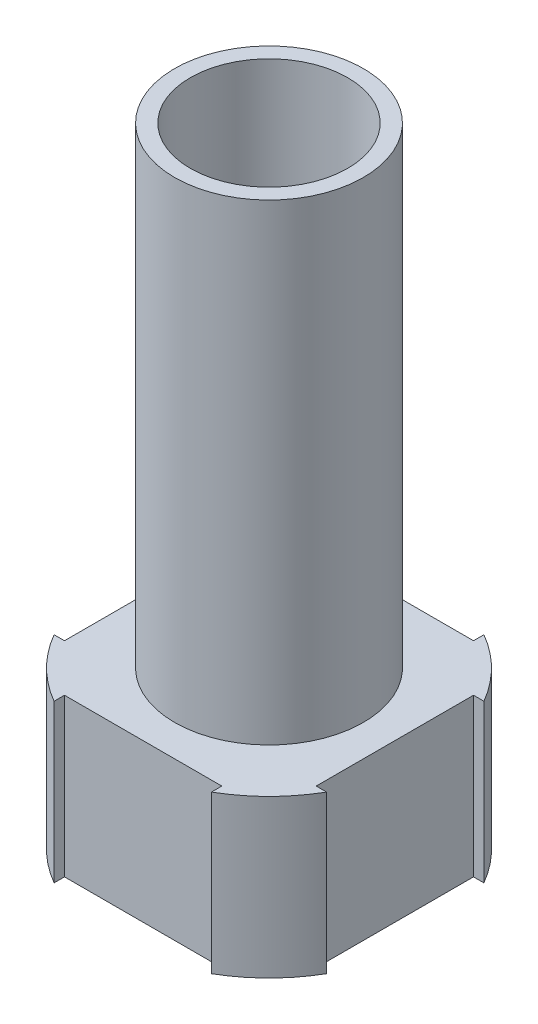
ISO-10303-21;
HEADER;
FILE_DESCRIPTION(('STEP AP214'),'2;1');
FILE_NAME('part.step','',(''),(''),'','','');
FILE_SCHEMA(('AUTOMOTIVE_DESIGN { 1 0 10303 214 1 1 1 1 }'));
ENDSEC;
DATA;
#1=APPLICATION_CONTEXT('core data for automotive mechanical design processes');
#2=APPLICATION_PROTOCOL_DEFINITION('international standard','automotive_design',2000,#1);
#3=PRODUCT_CONTEXT('',#1,'mechanical');
#4=PRODUCT('Part','Part','',(#3));
#5=PRODUCT_RELATED_PRODUCT_CATEGORY('part','',(#4));
#6=PRODUCT_DEFINITION_FORMATION('','',#4);
#7=PRODUCT_DEFINITION_CONTEXT('part definition',#1,'design');
#8=PRODUCT_DEFINITION('design','',#6,#7);
#9=PRODUCT_DEFINITION_SHAPE('','',#8);
#10=(LENGTH_UNIT() NAMED_UNIT(*) SI_UNIT(.MILLI.,.METRE.));
#11=(NAMED_UNIT(*) PLANE_ANGLE_UNIT() SI_UNIT($,.RADIAN.));
#12=(NAMED_UNIT(*) SI_UNIT($,.STERADIAN.) SOLID_ANGLE_UNIT());
#13=UNCERTAINTY_MEASURE_WITH_UNIT(LENGTH_MEASURE(1.E-05),#10,'distance_accuracy_value','');
#14=(GEOMETRIC_REPRESENTATION_CONTEXT(3) GLOBAL_UNCERTAINTY_ASSIGNED_CONTEXT((#13)) GLOBAL_UNIT_ASSIGNED_CONTEXT((#10,
#11,#12)) REPRESENTATION_CONTEXT('',''));
#15=CARTESIAN_POINT('',(0.,0.,0.));
#16=DIRECTION('',(0.,0.,1.));
#17=DIRECTION('',(1.,0.,0.));
#18=AXIS2_PLACEMENT_3D('',#15,#16,#17);
#19=CARTESIAN_POINT('',(0.,5.,0.));
#20=DIRECTION('',(0.,-1.,0.));
#21=DIRECTION('',(0.,0.,-1.));
#22=AXIS2_PLACEMENT_3D('',#19,#20,#21);
#23=CYLINDRICAL_SURFACE('',#22,5.);
#24=CARTESIAN_POINT('',(0.,0.,0.));
#25=DIRECTION('',(0.,1.,0.));
#26=DIRECTION('',(0.,0.,1.));
#27=AXIS2_PLACEMENT_3D('',#24,#25,#26);
#28=CIRCLE('',#27,5.);
#29=CARTESIAN_POINT('',(2.5,0.,4.33012701892219));
#30=VERTEX_POINT('',#29);
#31=CARTESIAN_POINT('',(4.33012701892219,0.,2.5));
#32=VERTEX_POINT('',#31);
#33=EDGE_CURVE('E272',#30,#32,#28,.T.);
#34=ORIENTED_EDGE('',*,*,#33,.T.);
#35=DIRECTION('',(0.,-1.,0.));
#36=VECTOR('',#35,1.);
#37=CARTESIAN_POINT('',(4.33012701892219,5.,2.5));
#38=LINE('',#37,#36);
#39=CARTESIAN_POINT('',(4.33012701892219,5.,2.5));
#40=VERTEX_POINT('',#39);
#41=EDGE_CURVE('E156',#32,#40,#38,.F.);
#42=ORIENTED_EDGE('',*,*,#41,.T.);
#43=CARTESIAN_POINT('',(0.,5.,0.));
#44=DIRECTION('',(0.,1.,0.));
#45=DIRECTION('',(0.,0.,1.));
#46=AXIS2_PLACEMENT_3D('',#43,#44,#45);
#47=CIRCLE('',#46,5.);
#48=CARTESIAN_POINT('',(2.5,5.,4.33012701892219));
#49=VERTEX_POINT('',#48);
#50=EDGE_CURVE('E273',#49,#40,#47,.T.);
#51=ORIENTED_EDGE('',*,*,#50,.F.);
#52=DIRECTION('',(0.,-1.,0.));
#53=VECTOR('',#52,1.);
#54=CARTESIAN_POINT('',(2.5,5.,4.33012701892219));
#55=LINE('',#54,#53);
#56=EDGE_CURVE('E254',#49,#30,#55,.T.);
#57=ORIENTED_EDGE('',*,*,#56,.T.);
#58=EDGE_LOOP('',(#34,#42,#51,#57));
#59=FACE_BOUND('',#58,.T.);
#60=ADVANCED_FACE('F36',(#59),#23,.T.);
#61=CARTESIAN_POINT('',(4.33012701892219,5.,-2.5));
#62=VERTEX_POINT('',#61);
#63=CARTESIAN_POINT('',(2.5,5.,-4.33012701892219));
#64=VERTEX_POINT('',#63);
#65=EDGE_CURVE('E276',#62,#64,#47,.T.);
#66=ORIENTED_EDGE('',*,*,#65,.F.);
#67=DIRECTION('',(0.,-1.,0.));
#68=VECTOR('',#67,1.);
#69=CARTESIAN_POINT('',(4.33012701892219,5.,-2.5));
#70=LINE('',#69,#68);
#71=CARTESIAN_POINT('',(4.33012701892219,0.,-2.5));
#72=VERTEX_POINT('',#71);
#73=EDGE_CURVE('E178',#62,#72,#70,.T.);
#74=ORIENTED_EDGE('',*,*,#73,.T.);
#75=CARTESIAN_POINT('',(2.5,0.,-4.33012701892219));
#76=VERTEX_POINT('',#75);
#77=EDGE_CURVE('E278',#72,#76,#28,.T.);
#78=ORIENTED_EDGE('',*,*,#77,.T.);
#79=DIRECTION('',(0.,-1.,0.));
#80=VECTOR('',#79,1.);
#81=CARTESIAN_POINT('',(2.5,5.,-4.33012701892219));
#82=LINE('',#81,#80);
#83=EDGE_CURVE('E208',#76,#64,#82,.F.);
#84=ORIENTED_EDGE('',*,*,#83,.T.);
#85=EDGE_LOOP('',(#66,#74,#78,#84));
#86=FACE_BOUND('',#85,.T.);
#87=ADVANCED_FACE('F295',(#86),#23,.T.);
#88=CARTESIAN_POINT('',(-2.5,5.,-4.33012701892219));
#89=VERTEX_POINT('',#88);
#90=CARTESIAN_POINT('',(-4.33012701892219,5.,-2.5));
#91=VERTEX_POINT('',#90);
#92=EDGE_CURVE('E321',#89,#91,#47,.T.);
#93=ORIENTED_EDGE('',*,*,#92,.F.);
#94=DIRECTION('',(0.,-1.,0.));
#95=VECTOR('',#94,1.);
#96=CARTESIAN_POINT('',(-2.5,5.,-4.33012701892219));
#97=LINE('',#96,#95);
#98=CARTESIAN_POINT('',(-2.5,0.,-4.33012701892219));
#99=VERTEX_POINT('',#98);
#100=EDGE_CURVE('E198',#89,#99,#97,.T.);
#101=ORIENTED_EDGE('',*,*,#100,.T.);
#102=CARTESIAN_POINT('',(-4.33012701892219,0.,-2.5));
#103=VERTEX_POINT('',#102);
#104=EDGE_CURVE('E331',#99,#103,#28,.T.);
#105=ORIENTED_EDGE('',*,*,#104,.T.);
#106=DIRECTION('',(0.,-1.,0.));
#107=VECTOR('',#106,1.);
#108=CARTESIAN_POINT('',(-4.33012701892219,5.,-2.5));
#109=LINE('',#108,#107);
#110=EDGE_CURVE('E236',#103,#91,#109,.F.);
#111=ORIENTED_EDGE('',*,*,#110,.T.);
#112=EDGE_LOOP('',(#93,#101,#105,#111));
#113=FACE_BOUND('',#112,.T.);
#114=ADVANCED_FACE('F288',(#113),#23,.T.);
#115=CARTESIAN_POINT('',(0.,20.,0.));
#116=DIRECTION('',(0.,-1.,0.));
#117=DIRECTION('',(0.,0.,-1.));
#118=AXIS2_PLACEMENT_3D('',#115,#116,#117);
#119=CYLINDRICAL_SURFACE('',#118,2.5);
#120=CARTESIAN_POINT('',(0.,20.,0.));
#121=DIRECTION('',(0.,1.,0.));
#122=DIRECTION('',(0.,0.,1.));
#123=AXIS2_PLACEMENT_3D('',#120,#121,#122);
#124=CIRCLE('',#123,2.5);
#125=CARTESIAN_POINT('',(0.,20.,2.5));
#126=VERTEX_POINT('',#125);
#127=EDGE_CURVE('E45',#126,#126,#124,.T.);
#128=ORIENTED_EDGE('',*,*,#127,.T.);
#129=EDGE_LOOP('',(#128));
#130=FACE_BOUND('',#129,.T.);
#131=CARTESIAN_POINT('',(0.,0.,0.));
#132=DIRECTION('',(0.,1.,0.));
#133=DIRECTION('',(0.,0.,1.));
#134=AXIS2_PLACEMENT_3D('',#131,#132,#133);
#135=CIRCLE('',#134,2.5);
#136=CARTESIAN_POINT('',(0.,0.,2.5));
#137=VERTEX_POINT('',#136);
#138=EDGE_CURVE('E40',#137,#137,#135,.T.);
#139=ORIENTED_EDGE('',*,*,#138,.F.);
#140=EDGE_LOOP('',(#139));
#141=FACE_BOUND('',#140,.T.);
#142=ADVANCED_FACE('F38',(#130,#141),#119,.F.);
#143=CARTESIAN_POINT('',(0.,20.,0.));
#144=DIRECTION('',(0.,-1.,0.));
#145=DIRECTION('',(0.,0.,-1.));
#146=AXIS2_PLACEMENT_3D('',#143,#144,#145);
#147=CYLINDRICAL_SURFACE('',#146,3.);
#148=CARTESIAN_POINT('',(0.,5.,0.));
#149=DIRECTION('',(0.,1.,0.));
#150=DIRECTION('',(0.,0.,1.));
#151=AXIS2_PLACEMENT_3D('',#148,#149,#150);
#152=CIRCLE('',#151,3.);
#153=CARTESIAN_POINT('',(0.,5.,3.));
#154=VERTEX_POINT('',#153);
#155=EDGE_CURVE('E268',#154,#154,#152,.T.);
#156=ORIENTED_EDGE('',*,*,#155,.T.);
#157=EDGE_LOOP('',(#156));
#158=FACE_BOUND('',#157,.T.);
#159=CARTESIAN_POINT('',(0.,20.,0.));
#160=DIRECTION('',(0.,1.,0.));
#161=DIRECTION('',(0.,0.,1.));
#162=AXIS2_PLACEMENT_3D('',#159,#160,#161);
#163=CIRCLE('',#162,3.);
#164=CARTESIAN_POINT('',(0.,20.,3.));
#165=VERTEX_POINT('',#164);
#166=EDGE_CURVE('E11',#165,#165,#163,.T.);
#167=ORIENTED_EDGE('',*,*,#166,.F.);
#168=EDGE_LOOP('',(#167));
#169=FACE_BOUND('',#168,.T.);
#170=ADVANCED_FACE('F287',(#158,#169),#147,.T.);
#171=CARTESIAN_POINT('',(0.,20.,0.));
#172=DIRECTION('',(0.,1.,0.));
#173=DIRECTION('',(0.,0.,1.));
#174=AXIS2_PLACEMENT_3D('',#171,#172,#173);
#175=PLANE('',#174);
#176=ORIENTED_EDGE('',*,*,#127,.F.);
#177=EDGE_LOOP('',(#176));
#178=FACE_BOUND('',#177,.T.);
#179=ORIENTED_EDGE('',*,*,#166,.T.);
#180=EDGE_LOOP('',(#179));
#181=FACE_BOUND('',#180,.T.);
#182=ADVANCED_FACE('F293',(#178,#181),#175,.T.);
#183=CARTESIAN_POINT('',(0.,0.,0.));
#184=DIRECTION('',(0.,1.,0.));
#185=DIRECTION('',(0.,0.,1.));
#186=AXIS2_PLACEMENT_3D('',#183,#184,#185);
#187=PLANE('',#186);
#188=ORIENTED_EDGE('',*,*,#138,.T.);
#189=EDGE_LOOP('',(#188));
#190=FACE_BOUND('',#189,.T.);
#191=DIRECTION('',(0.,0.,-1.));
#192=VECTOR('',#191,1.);
#193=CARTESIAN_POINT('',(4.,0.,2.5));
#194=LINE('',#193,#192);
#195=CARTESIAN_POINT('',(4.,0.,2.5));
#196=VERTEX_POINT('',#195);
#197=CARTESIAN_POINT('',(4.,0.,-2.5));
#198=VERTEX_POINT('',#197);
#199=EDGE_CURVE('E165',#196,#198,#194,.T.);
#200=ORIENTED_EDGE('',*,*,#199,.F.);
#201=DIRECTION('',(1.,0.,0.));
#202=VECTOR('',#201,1.);
#203=CARTESIAN_POINT('',(4.,0.,2.5));
#204=LINE('',#203,#202);
#205=EDGE_CURVE('E151',#196,#32,#204,.T.);
#206=ORIENTED_EDGE('',*,*,#205,.T.);
#207=ORIENTED_EDGE('',*,*,#33,.F.);
#208=DIRECTION('',(0.,0.,1.));
#209=VECTOR('',#208,1.);
#210=CARTESIAN_POINT('',(2.5,0.,4.));
#211=LINE('',#210,#209);
#212=CARTESIAN_POINT('',(2.5,0.,4.));
#213=VERTEX_POINT('',#212);
#214=EDGE_CURVE('E258',#213,#30,#211,.T.);
#215=ORIENTED_EDGE('',*,*,#214,.F.);
#216=DIRECTION('',(1.,0.,0.));
#217=VECTOR('',#216,1.);
#218=CARTESIAN_POINT('',(-2.5,0.,4.));
#219=LINE('',#218,#217);
#220=CARTESIAN_POINT('',(-2.5,0.,4.));
#221=VERTEX_POINT('',#220);
#222=EDGE_CURVE('E242',#221,#213,#219,.T.);
#223=ORIENTED_EDGE('',*,*,#222,.F.);
#224=DIRECTION('',(0.,0.,1.));
#225=VECTOR('',#224,1.);
#226=CARTESIAN_POINT('',(-2.5,0.,4.));
#227=LINE('',#226,#225);
#228=CARTESIAN_POINT('',(-2.5,0.,4.33012701892219));
#229=VERTEX_POINT('',#228);
#230=EDGE_CURVE('E250',#221,#229,#227,.T.);
#231=ORIENTED_EDGE('',*,*,#230,.T.);
#232=CARTESIAN_POINT('',(-4.33012701892219,0.,2.5));
#233=VERTEX_POINT('',#232);
#234=EDGE_CURVE('E267',#233,#229,#28,.T.);
#235=ORIENTED_EDGE('',*,*,#234,.F.);
#236=DIRECTION('',(-1.,0.,0.));
#237=VECTOR('',#236,1.);
#238=CARTESIAN_POINT('',(-4.,0.,2.5));
#239=LINE('',#238,#237);
#240=CARTESIAN_POINT('',(-4.,0.,2.5));
#241=VERTEX_POINT('',#240);
#242=EDGE_CURVE('E230',#241,#233,#239,.T.);
#243=ORIENTED_EDGE('',*,*,#242,.F.);
#244=DIRECTION('',(0.,0.,1.));
#245=VECTOR('',#244,1.);
#246=CARTESIAN_POINT('',(-4.,0.,-2.5));
#247=LINE('',#246,#245);
#248=CARTESIAN_POINT('',(-4.,0.,-2.5));
#249=VERTEX_POINT('',#248);
#250=EDGE_CURVE('E214',#249,#241,#247,.T.);
#251=ORIENTED_EDGE('',*,*,#250,.F.);
#252=DIRECTION('',(-1.,0.,0.));
#253=VECTOR('',#252,1.);
#254=CARTESIAN_POINT('',(-4.,0.,-2.5));
#255=LINE('',#254,#253);
#256=EDGE_CURVE('E222',#249,#103,#255,.T.);
#257=ORIENTED_EDGE('',*,*,#256,.T.);
#258=ORIENTED_EDGE('',*,*,#104,.F.);
#259=DIRECTION('',(0.,0.,-1.));
#260=VECTOR('',#259,1.);
#261=CARTESIAN_POINT('',(-2.5,0.,-4.));
#262=LINE('',#261,#260);
#263=CARTESIAN_POINT('',(-2.5,0.,-4.));
#264=VERTEX_POINT('',#263);
#265=EDGE_CURVE('E202',#264,#99,#262,.T.);
#266=ORIENTED_EDGE('',*,*,#265,.F.);
#267=DIRECTION('',(-1.,0.,0.));
#268=VECTOR('',#267,1.);
#269=CARTESIAN_POINT('',(2.5,0.,-4.));
#270=LINE('',#269,#268);
#271=CARTESIAN_POINT('',(2.5,0.,-4.));
#272=VERTEX_POINT('',#271);
#273=EDGE_CURVE('E189',#272,#264,#270,.T.);
#274=ORIENTED_EDGE('',*,*,#273,.F.);
#275=DIRECTION('',(0.,0.,-1.));
#276=VECTOR('',#275,1.);
#277=CARTESIAN_POINT('',(2.5,0.,-4.));
#278=LINE('',#277,#276);
#279=EDGE_CURVE('E194',#272,#76,#278,.T.);
#280=ORIENTED_EDGE('',*,*,#279,.T.);
#281=ORIENTED_EDGE('',*,*,#77,.F.);
#282=DIRECTION('',(1.,0.,0.));
#283=VECTOR('',#282,1.);
#284=CARTESIAN_POINT('',(4.,0.,-2.5));
#285=LINE('',#284,#283);
#286=EDGE_CURVE('E161',#198,#72,#285,.T.);
#287=ORIENTED_EDGE('',*,*,#286,.F.);
#288=EDGE_LOOP('',(#200,#206,#207,#215,#223,#231,#235,#243,#251,#257,#258,#266,#274,#280,#281,#287));
#289=FACE_BOUND('',#288,.T.);
#290=ADVANCED_FACE('F170',(#190,#289),#187,.F.);
#291=CARTESIAN_POINT('',(-4.33012701892219,5.,2.5));
#292=VERTEX_POINT('',#291);
#293=CARTESIAN_POINT('',(-2.5,5.,4.33012701892219));
#294=VERTEX_POINT('',#293);
#295=EDGE_CURVE('E271',#292,#294,#47,.T.);
#296=ORIENTED_EDGE('',*,*,#295,.F.);
#297=DIRECTION('',(0.,-1.,0.));
#298=VECTOR('',#297,1.);
#299=CARTESIAN_POINT('',(-4.33012701892219,5.,2.5));
#300=LINE('',#299,#298);
#301=EDGE_CURVE('E226',#292,#233,#300,.T.);
#302=ORIENTED_EDGE('',*,*,#301,.T.);
#303=ORIENTED_EDGE('',*,*,#234,.T.);
#304=DIRECTION('',(0.,-1.,0.));
#305=VECTOR('',#304,1.);
#306=CARTESIAN_POINT('',(-2.5,5.,4.33012701892219));
#307=LINE('',#306,#305);
#308=EDGE_CURVE('E264',#229,#294,#307,.F.);
#309=ORIENTED_EDGE('',*,*,#308,.T.);
#310=EDGE_LOOP('',(#296,#302,#303,#309));
#311=FACE_BOUND('',#310,.T.);
#312=ADVANCED_FACE('F298',(#311),#23,.T.);
#313=CARTESIAN_POINT('',(0.,5.,0.));
#314=DIRECTION('',(0.,1.,0.));
#315=DIRECTION('',(0.,0.,1.));
#316=AXIS2_PLACEMENT_3D('',#313,#314,#315);
#317=PLANE('',#316);
#318=DIRECTION('',(1.,0.,0.));
#319=VECTOR('',#318,1.);
#320=CARTESIAN_POINT('',(4.,5.,2.5));
#321=LINE('',#320,#319);
#322=CARTESIAN_POINT('',(4.,5.,2.5));
#323=VERTEX_POINT('',#322);
#324=EDGE_CURVE('E176',#323,#40,#321,.T.);
#325=ORIENTED_EDGE('',*,*,#324,.F.);
#326=DIRECTION('',(0.,0.,1.));
#327=VECTOR('',#326,1.);
#328=CARTESIAN_POINT('',(4.,5.,2.5));
#329=LINE('',#328,#327);
#330=CARTESIAN_POINT('',(4.,5.,-2.5));
#331=VERTEX_POINT('',#330);
#332=EDGE_CURVE('E162',#331,#323,#329,.T.);
#333=ORIENTED_EDGE('',*,*,#332,.F.);
#334=DIRECTION('',(1.,0.,0.));
#335=VECTOR('',#334,1.);
#336=CARTESIAN_POINT('',(4.,5.,-2.5));
#337=LINE('',#336,#335);
#338=EDGE_CURVE('E179',#331,#62,#337,.T.);
#339=ORIENTED_EDGE('',*,*,#338,.T.);
#340=ORIENTED_EDGE('',*,*,#65,.T.);
#341=DIRECTION('',(0.,0.,-1.));
#342=VECTOR('',#341,1.);
#343=CARTESIAN_POINT('',(2.5,5.,-4.));
#344=LINE('',#343,#342);
#345=CARTESIAN_POINT('',(2.5,5.,-4.));
#346=VERTEX_POINT('',#345);
#347=EDGE_CURVE('E195',#346,#64,#344,.T.);
#348=ORIENTED_EDGE('',*,*,#347,.F.);
#349=DIRECTION('',(1.,0.,0.));
#350=VECTOR('',#349,1.);
#351=CARTESIAN_POINT('',(2.5,5.,-4.));
#352=LINE('',#351,#350);
#353=CARTESIAN_POINT('',(-2.5,5.,-4.));
#354=VERTEX_POINT('',#353);
#355=EDGE_CURVE('E192',#354,#346,#352,.T.);
#356=ORIENTED_EDGE('',*,*,#355,.F.);
#357=DIRECTION('',(0.,0.,-1.));
#358=VECTOR('',#357,1.);
#359=CARTESIAN_POINT('',(-2.5,5.,-4.));
#360=LINE('',#359,#358);
#361=EDGE_CURVE('E199',#354,#89,#360,.T.);
#362=ORIENTED_EDGE('',*,*,#361,.T.);
#363=ORIENTED_EDGE('',*,*,#92,.T.);
#364=DIRECTION('',(-1.,0.,0.));
#365=VECTOR('',#364,1.);
#366=CARTESIAN_POINT('',(-4.,5.,-2.5));
#367=LINE('',#366,#365);
#368=CARTESIAN_POINT('',(-4.,5.,-2.5));
#369=VERTEX_POINT('',#368);
#370=EDGE_CURVE('E223',#369,#91,#367,.T.);
#371=ORIENTED_EDGE('',*,*,#370,.F.);
#372=DIRECTION('',(0.,0.,-1.));
#373=VECTOR('',#372,1.);
#374=CARTESIAN_POINT('',(-4.,5.,-2.5));
#375=LINE('',#374,#373);
#376=CARTESIAN_POINT('',(-4.,5.,2.5));
#377=VERTEX_POINT('',#376);
#378=EDGE_CURVE('E219',#377,#369,#375,.T.);
#379=ORIENTED_EDGE('',*,*,#378,.F.);
#380=DIRECTION('',(-1.,0.,0.));
#381=VECTOR('',#380,1.);
#382=CARTESIAN_POINT('',(-4.,5.,2.5));
#383=LINE('',#382,#381);
#384=EDGE_CURVE('E227',#377,#292,#383,.T.);
#385=ORIENTED_EDGE('',*,*,#384,.T.);
#386=ORIENTED_EDGE('',*,*,#295,.T.);
#387=DIRECTION('',(0.,0.,1.));
#388=VECTOR('',#387,1.);
#389=CARTESIAN_POINT('',(-2.5,5.,4.));
#390=LINE('',#389,#388);
#391=CARTESIAN_POINT('',(-2.5,5.,4.));
#392=VERTEX_POINT('',#391);
#393=EDGE_CURVE('E251',#392,#294,#390,.T.);
#394=ORIENTED_EDGE('',*,*,#393,.F.);
#395=DIRECTION('',(-1.,0.,0.));
#396=VECTOR('',#395,1.);
#397=CARTESIAN_POINT('',(-2.5,5.,4.));
#398=LINE('',#397,#396);
#399=CARTESIAN_POINT('',(2.5,5.,4.));
#400=VERTEX_POINT('',#399);
#401=EDGE_CURVE('E247',#400,#392,#398,.T.);
#402=ORIENTED_EDGE('',*,*,#401,.F.);
#403=DIRECTION('',(0.,0.,1.));
#404=VECTOR('',#403,1.);
#405=CARTESIAN_POINT('',(2.5,5.,4.));
#406=LINE('',#405,#404);
#407=EDGE_CURVE('E255',#400,#49,#406,.T.);
#408=ORIENTED_EDGE('',*,*,#407,.T.);
#409=ORIENTED_EDGE('',*,*,#50,.T.);
#410=EDGE_LOOP('',(#325,#333,#339,#340,#348,#356,#362,#363,#371,#379,#385,#386,#394,#402,#408,#409));
#411=FACE_BOUND('',#410,.T.);
#412=ORIENTED_EDGE('',*,*,#155,.F.);
#413=EDGE_LOOP('',(#412));
#414=FACE_BOUND('',#413,.T.);
#415=ADVANCED_FACE('F308',(#411,#414),#317,.T.);
#416=CARTESIAN_POINT('',(-2.5,5.,4.));
#417=DIRECTION('',(-1.,0.,0.));
#418=DIRECTION('',(0.,-1.,0.));
#419=AXIS2_PLACEMENT_3D('',#416,#417,#418);
#420=PLANE('',#419);
#421=ORIENTED_EDGE('',*,*,#230,.F.);
#422=DIRECTION('',(0.,-1.,0.));
#423=VECTOR('',#422,1.);
#424=CARTESIAN_POINT('',(-2.5,5.,4.));
#425=LINE('',#424,#423);
#426=EDGE_CURVE('E239',#392,#221,#425,.T.);
#427=ORIENTED_EDGE('',*,*,#426,.F.);
#428=ORIENTED_EDGE('',*,*,#393,.T.);
#429=ORIENTED_EDGE('',*,*,#308,.F.);
#430=EDGE_LOOP('',(#421,#427,#428,#429));
#431=FACE_BOUND('',#430,.T.);
#432=ADVANCED_FACE('F314',(#431),#420,.F.);
#433=CARTESIAN_POINT('',(2.5,5.,4.));
#434=DIRECTION('',(1.,0.,0.));
#435=DIRECTION('',(0.,1.,0.));
#436=AXIS2_PLACEMENT_3D('',#433,#434,#435);
#437=PLANE('',#436);
#438=ORIENTED_EDGE('',*,*,#407,.F.);
#439=DIRECTION('',(0.,1.,0.));
#440=VECTOR('',#439,1.);
#441=CARTESIAN_POINT('',(2.5,5.,4.));
#442=LINE('',#441,#440);
#443=EDGE_CURVE('E245',#213,#400,#442,.T.);
#444=ORIENTED_EDGE('',*,*,#443,.F.);
#445=ORIENTED_EDGE('',*,*,#214,.T.);
#446=ORIENTED_EDGE('',*,*,#56,.F.);
#447=EDGE_LOOP('',(#438,#444,#445,#446));
#448=FACE_BOUND('',#447,.T.);
#449=ADVANCED_FACE('F344',(#448),#437,.F.);
#450=CARTESIAN_POINT('',(0.,0.,4.));
#451=DIRECTION('',(0.,0.,1.));
#452=DIRECTION('',(1.,0.,0.));
#453=AXIS2_PLACEMENT_3D('',#450,#451,#452);
#454=PLANE('',#453);
#455=ORIENTED_EDGE('',*,*,#426,.T.);
#456=ORIENTED_EDGE('',*,*,#222,.T.);
#457=ORIENTED_EDGE('',*,*,#443,.T.);
#458=ORIENTED_EDGE('',*,*,#401,.T.);
#459=EDGE_LOOP('',(#455,#456,#457,#458));
#460=FACE_BOUND('',#459,.T.);
#461=ADVANCED_FACE('F339',(#460),#454,.T.);
#462=CARTESIAN_POINT('',(-4.,5.,-2.5));
#463=DIRECTION('',(0.,0.,-1.));
#464=DIRECTION('',(0.,1.,0.));
#465=AXIS2_PLACEMENT_3D('',#462,#463,#464);
#466=PLANE('',#465);
#467=ORIENTED_EDGE('',*,*,#256,.F.);
#468=DIRECTION('',(0.,-1.,0.));
#469=VECTOR('',#468,1.);
#470=CARTESIAN_POINT('',(-4.,5.,-2.5));
#471=LINE('',#470,#469);
#472=EDGE_CURVE('E211',#369,#249,#471,.T.);
#473=ORIENTED_EDGE('',*,*,#472,.F.);
#474=ORIENTED_EDGE('',*,*,#370,.T.);
#475=ORIENTED_EDGE('',*,*,#110,.F.);
#476=EDGE_LOOP('',(#467,#473,#474,#475));
#477=FACE_BOUND('',#476,.T.);
#478=ADVANCED_FACE('F351',(#477),#466,.F.);
#479=CARTESIAN_POINT('',(-4.,5.,2.5));
#480=DIRECTION('',(0.,0.,1.));
#481=DIRECTION('',(0.,-1.,0.));
#482=AXIS2_PLACEMENT_3D('',#479,#480,#481);
#483=PLANE('',#482);
#484=ORIENTED_EDGE('',*,*,#384,.F.);
#485=DIRECTION('',(0.,1.,0.));
#486=VECTOR('',#485,1.);
#487=CARTESIAN_POINT('',(-4.,5.,2.5));
#488=LINE('',#487,#486);
#489=EDGE_CURVE('E217',#241,#377,#488,.T.);
#490=ORIENTED_EDGE('',*,*,#489,.F.);
#491=ORIENTED_EDGE('',*,*,#242,.T.);
#492=ORIENTED_EDGE('',*,*,#301,.F.);
#493=EDGE_LOOP('',(#484,#490,#491,#492));
#494=FACE_BOUND('',#493,.T.);
#495=ADVANCED_FACE('F357',(#494),#483,.F.);
#496=CARTESIAN_POINT('',(-4.,0.,0.));
#497=DIRECTION('',(-1.,0.,0.));
#498=DIRECTION('',(0.,0.,1.));
#499=AXIS2_PLACEMENT_3D('',#496,#497,#498);
#500=PLANE('',#499);
#501=ORIENTED_EDGE('',*,*,#472,.T.);
#502=ORIENTED_EDGE('',*,*,#250,.T.);
#503=ORIENTED_EDGE('',*,*,#489,.T.);
#504=ORIENTED_EDGE('',*,*,#378,.T.);
#505=EDGE_LOOP('',(#501,#502,#503,#504));
#506=FACE_BOUND('',#505,.T.);
#507=ADVANCED_FACE('F361',(#506),#500,.T.);
#508=CARTESIAN_POINT('',(2.5,5.,-4.));
#509=DIRECTION('',(1.,0.,0.));
#510=DIRECTION('',(0.,1.,0.));
#511=AXIS2_PLACEMENT_3D('',#508,#509,#510);
#512=PLANE('',#511);
#513=ORIENTED_EDGE('',*,*,#279,.F.);
#514=DIRECTION('',(0.,-1.,0.));
#515=VECTOR('',#514,1.);
#516=CARTESIAN_POINT('',(2.5,5.,-4.));
#517=LINE('',#516,#515);
#518=EDGE_CURVE('E186',#346,#272,#517,.T.);
#519=ORIENTED_EDGE('',*,*,#518,.F.);
#520=ORIENTED_EDGE('',*,*,#347,.T.);
#521=ORIENTED_EDGE('',*,*,#83,.F.);
#522=EDGE_LOOP('',(#513,#519,#520,#521));
#523=FACE_BOUND('',#522,.T.);
#524=ADVANCED_FACE('F330',(#523),#512,.F.);
#525=CARTESIAN_POINT('',(-2.5,5.,-4.));
#526=DIRECTION('',(-1.,0.,0.));
#527=DIRECTION('',(0.,-1.,0.));
#528=AXIS2_PLACEMENT_3D('',#525,#526,#527);
#529=PLANE('',#528);
#530=ORIENTED_EDGE('',*,*,#361,.F.);
#531=DIRECTION('',(0.,1.,0.));
#532=VECTOR('',#531,1.);
#533=CARTESIAN_POINT('',(-2.5,5.,-4.));
#534=LINE('',#533,#532);
#535=EDGE_CURVE('E60',#264,#354,#534,.T.);
#536=ORIENTED_EDGE('',*,*,#535,.F.);
#537=ORIENTED_EDGE('',*,*,#265,.T.);
#538=ORIENTED_EDGE('',*,*,#100,.F.);
#539=EDGE_LOOP('',(#530,#536,#537,#538));
#540=FACE_BOUND('',#539,.T.);
#541=ADVANCED_FACE('F368',(#540),#529,.F.);
#542=CARTESIAN_POINT('',(0.,0.,-4.));
#543=DIRECTION('',(0.,0.,-1.));
#544=DIRECTION('',(-1.,0.,0.));
#545=AXIS2_PLACEMENT_3D('',#542,#543,#544);
#546=PLANE('',#545);
#547=ORIENTED_EDGE('',*,*,#518,.T.);
#548=ORIENTED_EDGE('',*,*,#273,.T.);
#549=ORIENTED_EDGE('',*,*,#535,.T.);
#550=ORIENTED_EDGE('',*,*,#355,.T.);
#551=EDGE_LOOP('',(#547,#548,#549,#550));
#552=FACE_BOUND('',#551,.T.);
#553=ADVANCED_FACE('F371',(#552),#546,.T.);
#554=CARTESIAN_POINT('',(4.,5.,2.5));
#555=DIRECTION('',(0.,0.,1.));
#556=DIRECTION('',(0.,-1.,0.));
#557=AXIS2_PLACEMENT_3D('',#554,#555,#556);
#558=PLANE('',#557);
#559=ORIENTED_EDGE('',*,*,#205,.F.);
#560=DIRECTION('',(0.,-1.,0.));
#561=VECTOR('',#560,1.);
#562=CARTESIAN_POINT('',(4.,5.,2.5));
#563=LINE('',#562,#561);
#564=EDGE_CURVE('E154',#323,#196,#563,.T.);
#565=ORIENTED_EDGE('',*,*,#564,.F.);
#566=ORIENTED_EDGE('',*,*,#324,.T.);
#567=ORIENTED_EDGE('',*,*,#41,.F.);
#568=EDGE_LOOP('',(#559,#565,#566,#567));
#569=FACE_BOUND('',#568,.T.);
#570=ADVANCED_FACE('F153',(#569),#558,.F.);
#571=CARTESIAN_POINT('',(4.,5.,-2.5));
#572=DIRECTION('',(0.,0.,-1.));
#573=DIRECTION('',(0.,1.,0.));
#574=AXIS2_PLACEMENT_3D('',#571,#572,#573);
#575=PLANE('',#574);
#576=ORIENTED_EDGE('',*,*,#338,.F.);
#577=DIRECTION('',(0.,1.,0.));
#578=VECTOR('',#577,1.);
#579=CARTESIAN_POINT('',(4.,5.,-2.5));
#580=LINE('',#579,#578);
#581=EDGE_CURVE('E52',#198,#331,#580,.T.);
#582=ORIENTED_EDGE('',*,*,#581,.F.);
#583=ORIENTED_EDGE('',*,*,#286,.T.);
#584=ORIENTED_EDGE('',*,*,#73,.F.);
#585=EDGE_LOOP('',(#576,#582,#583,#584));
#586=FACE_BOUND('',#585,.T.);
#587=ADVANCED_FACE('F377',(#586),#575,.F.);
#588=CARTESIAN_POINT('',(4.,0.,0.));
#589=DIRECTION('',(1.,0.,0.));
#590=DIRECTION('',(0.,0.,-1.));
#591=AXIS2_PLACEMENT_3D('',#588,#589,#590);
#592=PLANE('',#591);
#593=ORIENTED_EDGE('',*,*,#564,.T.);
#594=ORIENTED_EDGE('',*,*,#199,.T.);
#595=ORIENTED_EDGE('',*,*,#581,.T.);
#596=ORIENTED_EDGE('',*,*,#332,.T.);
#597=EDGE_LOOP('',(#593,#594,#595,#596));
#598=FACE_BOUND('',#597,.T.);
#599=ADVANCED_FACE('F164',(#598),#592,.T.);
#600=CLOSED_SHELL('',(#60,#87,#114,#142,#170,#182,#290,#312,#415,#432,#449,#461,#478,#495,#507,
#524,#541,#553,#570,#587,#599));
#601=MANIFOLD_SOLID_BREP('B2',#600);
#602=ADVANCED_BREP_SHAPE_REPRESENTATION('',(#18,#601),#14);
#603=SHAPE_DEFINITION_REPRESENTATION(#9,#602);
ENDSEC;
END-ISO-10303-21;
